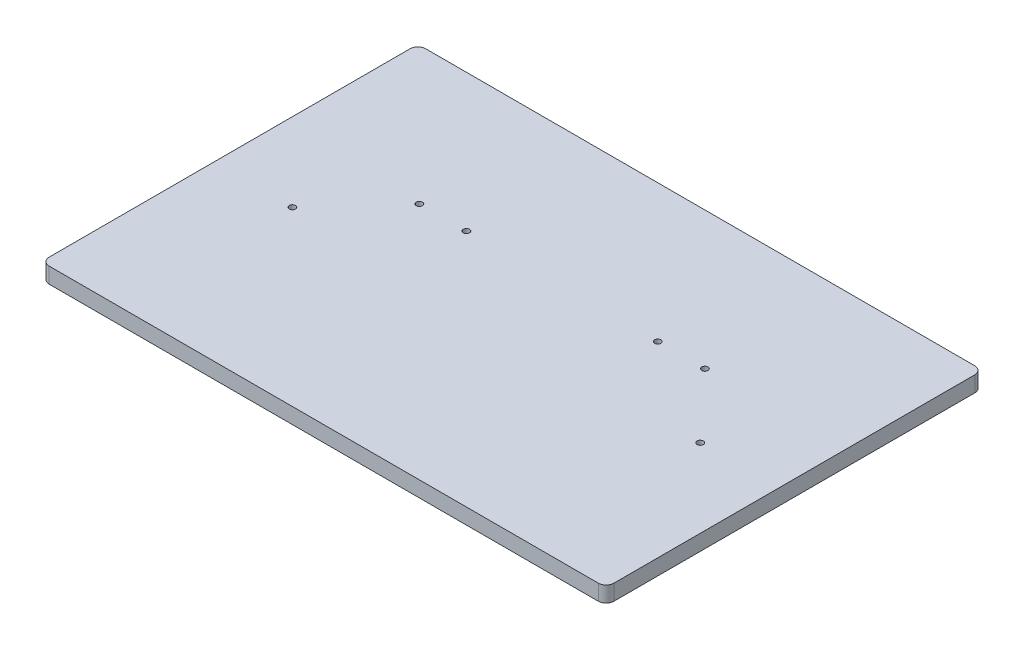
ISO-10303-21;
HEADER;
FILE_DESCRIPTION(('STEP AP214'),'2;1');
FILE_NAME('part.step','',(''),(''),'','','');
FILE_SCHEMA(('AUTOMOTIVE_DESIGN { 1 0 10303 214 1 1 1 1 }'));
ENDSEC;
DATA;
#1=APPLICATION_CONTEXT('core data for automotive mechanical design processes');
#2=APPLICATION_PROTOCOL_DEFINITION('international standard','automotive_design',2000,#1);
#3=PRODUCT_CONTEXT('',#1,'mechanical');
#4=PRODUCT('Part','Part','',(#3));
#5=PRODUCT_RELATED_PRODUCT_CATEGORY('part','',(#4));
#6=PRODUCT_DEFINITION_FORMATION('','',#4);
#7=PRODUCT_DEFINITION_CONTEXT('part definition',#1,'design');
#8=PRODUCT_DEFINITION('design','',#6,#7);
#9=PRODUCT_DEFINITION_SHAPE('','',#8);
#10=(LENGTH_UNIT() NAMED_UNIT(*) SI_UNIT(.MILLI.,.METRE.));
#11=(NAMED_UNIT(*) PLANE_ANGLE_UNIT() SI_UNIT($,.RADIAN.));
#12=(NAMED_UNIT(*) SI_UNIT($,.STERADIAN.) SOLID_ANGLE_UNIT());
#13=UNCERTAINTY_MEASURE_WITH_UNIT(LENGTH_MEASURE(1.E-05),#10,'distance_accuracy_value','');
#14=(GEOMETRIC_REPRESENTATION_CONTEXT(3) GLOBAL_UNCERTAINTY_ASSIGNED_CONTEXT((#13)) GLOBAL_UNIT_ASSIGNED_CONTEXT((#10,
#11,#12)) REPRESENTATION_CONTEXT('',''));
#15=CARTESIAN_POINT('',(0.,0.,0.));
#16=DIRECTION('',(0.,0.,1.));
#17=DIRECTION('',(1.,0.,0.));
#18=AXIS2_PLACEMENT_3D('',#15,#16,#17);
#19=CARTESIAN_POINT('',(-222.25,12.7,-146.05));
#20=DIRECTION('',(0.,1.,0.));
#21=DIRECTION('',(0.,0.,1.));
#22=AXIS2_PLACEMENT_3D('',#19,#20,#21);
#23=PLANE('',#22);
#24=CARTESIAN_POINT('',(115.07469238,12.7,-41.0459369351617));
#25=DIRECTION('',(0.,1.,0.));
#26=DIRECTION('',(0.,0.,1.));
#27=AXIS2_PLACEMENT_3D('',#24,#25,#26);
#28=CIRCLE('',#27,2.54000000000001);
#29=CARTESIAN_POINT('',(115.07469238,12.7,-38.5059369351617));
#30=VERTEX_POINT('',#29);
#31=EDGE_CURVE('E209',#30,#30,#28,.T.);
#32=ORIENTED_EDGE('',*,*,#31,.F.);
#33=EDGE_LOOP('',(#32));
#34=FACE_BOUND('',#33,.T.);
#35=CARTESIAN_POINT('',(76.97469238,12.7,-41.0459369351617));
#36=DIRECTION('',(0.,1.,0.));
#37=DIRECTION('',(0.,0.,1.));
#38=AXIS2_PLACEMENT_3D('',#35,#36,#37);
#39=CIRCLE('',#38,2.54);
#40=CARTESIAN_POINT('',(76.97469238,12.7,-38.5059369351617));
#41=VERTEX_POINT('',#40);
#42=EDGE_CURVE('E203',#41,#41,#39,.T.);
#43=ORIENTED_EDGE('',*,*,#42,.F.);
#44=EDGE_LOOP('',(#43));
#45=FACE_BOUND('',#44,.T.);
#46=CARTESIAN_POINT('',(-77.96530762,12.7,-41.0459369351617));
#47=DIRECTION('',(0.,1.,0.));
#48=DIRECTION('',(0.,0.,1.));
#49=AXIS2_PLACEMENT_3D('',#46,#47,#48);
#50=CIRCLE('',#49,2.53999999999998);
#51=CARTESIAN_POINT('',(-77.96530762,12.7,-38.5059369351617));
#52=VERTEX_POINT('',#51);
#53=EDGE_CURVE('E197',#52,#52,#50,.T.);
#54=ORIENTED_EDGE('',*,*,#53,.F.);
#55=EDGE_LOOP('',(#54));
#56=FACE_BOUND('',#55,.T.);
#57=CARTESIAN_POINT('',(-116.06530762,12.7,-41.0459369351617));
#58=DIRECTION('',(0.,1.,0.));
#59=DIRECTION('',(0.,0.,1.));
#60=AXIS2_PLACEMENT_3D('',#57,#58,#59);
#61=CIRCLE('',#60,2.53999999999998);
#62=CARTESIAN_POINT('',(-116.06530762,12.7,-38.5059369351617));
#63=VERTEX_POINT('',#62);
#64=EDGE_CURVE('E191',#63,#63,#61,.T.);
#65=ORIENTED_EDGE('',*,*,#64,.F.);
#66=EDGE_LOOP('',(#65));
#67=FACE_BOUND('',#66,.T.);
#68=CARTESIAN_POINT('',(-165.1,12.7,12.7));
#69=DIRECTION('',(0.,1.,0.));
#70=DIRECTION('',(0.,0.,1.));
#71=AXIS2_PLACEMENT_3D('',#68,#69,#70);
#72=CIRCLE('',#71,2.53999999999998);
#73=CARTESIAN_POINT('',(-165.1,12.7,15.24));
#74=VERTEX_POINT('',#73);
#75=EDGE_CURVE('E134',#74,#74,#72,.T.);
#76=ORIENTED_EDGE('',*,*,#75,.F.);
#77=EDGE_LOOP('',(#76));
#78=FACE_BOUND('',#77,.T.);
#79=CARTESIAN_POINT('',(-222.25,12.7,-146.05));
#80=DIRECTION('',(0.,1.,0.));
#81=DIRECTION('',(0.,0.,1.));
#82=AXIS2_PLACEMENT_3D('',#79,#80,#81);
#83=CIRCLE('',#82,6.34999999999999);
#84=CARTESIAN_POINT('',(-222.25,12.7,-152.4));
#85=VERTEX_POINT('',#84);
#86=CARTESIAN_POINT('',(-228.6,12.7,-146.05));
#87=VERTEX_POINT('',#86);
#88=EDGE_CURVE('E145',#85,#87,#83,.T.);
#89=ORIENTED_EDGE('',*,*,#88,.T.);
#90=DIRECTION('',(0.,0.,1.));
#91=VECTOR('',#90,1.);
#92=CARTESIAN_POINT('',(-228.6,12.7,-146.05));
#93=LINE('',#92,#91);
#94=CARTESIAN_POINT('',(-228.6,12.7,146.05));
#95=VERTEX_POINT('',#94);
#96=EDGE_CURVE('E93',#87,#95,#93,.T.);
#97=ORIENTED_EDGE('',*,*,#96,.T.);
#98=CARTESIAN_POINT('',(-222.25,12.7,146.05));
#99=DIRECTION('',(0.,1.,0.));
#100=DIRECTION('',(0.,0.,-1.));
#101=AXIS2_PLACEMENT_3D('',#98,#99,#100);
#102=CIRCLE('',#101,6.34999999999999);
#103=CARTESIAN_POINT('',(-222.25,12.7,152.4));
#104=VERTEX_POINT('',#103);
#105=EDGE_CURVE('E160',#95,#104,#102,.T.);
#106=ORIENTED_EDGE('',*,*,#105,.T.);
#107=DIRECTION('',(1.,0.,0.));
#108=VECTOR('',#107,1.);
#109=CARTESIAN_POINT('',(222.25,12.7,152.4));
#110=LINE('',#109,#108);
#111=CARTESIAN_POINT('',(222.25,12.7,152.4));
#112=VERTEX_POINT('',#111);
#113=EDGE_CURVE('E173',#104,#112,#110,.T.);
#114=ORIENTED_EDGE('',*,*,#113,.T.);
#115=CARTESIAN_POINT('',(222.25,12.7,146.05));
#116=DIRECTION('',(0.,1.,0.));
#117=DIRECTION('',(0.,0.,-1.));
#118=AXIS2_PLACEMENT_3D('',#115,#116,#117);
#119=CIRCLE('',#118,6.34999999999999);
#120=CARTESIAN_POINT('',(228.6,12.7,146.05));
#121=VERTEX_POINT('',#120);
#122=EDGE_CURVE('E112',#112,#121,#119,.T.);
#123=ORIENTED_EDGE('',*,*,#122,.T.);
#124=DIRECTION('',(0.,0.,-1.));
#125=VECTOR('',#124,1.);
#126=CARTESIAN_POINT('',(228.6,12.7,-146.05));
#127=LINE('',#126,#125);
#128=CARTESIAN_POINT('',(228.6,12.7,-146.05));
#129=VERTEX_POINT('',#128);
#130=EDGE_CURVE('E106',#121,#129,#127,.T.);
#131=ORIENTED_EDGE('',*,*,#130,.T.);
#132=CARTESIAN_POINT('',(222.25,12.7,-146.05));
#133=DIRECTION('',(0.,1.,0.));
#134=DIRECTION('',(0.,0.,-1.));
#135=AXIS2_PLACEMENT_3D('',#132,#133,#134);
#136=CIRCLE('',#135,6.34999999999999);
#137=CARTESIAN_POINT('',(222.25,12.7,-152.4));
#138=VERTEX_POINT('',#137);
#139=EDGE_CURVE('E110',#129,#138,#136,.T.);
#140=ORIENTED_EDGE('',*,*,#139,.T.);
#141=DIRECTION('',(-1.,0.,0.));
#142=VECTOR('',#141,1.);
#143=CARTESIAN_POINT('',(222.25,12.7,-152.4));
#144=LINE('',#143,#142);
#145=EDGE_CURVE('E50',#138,#85,#144,.T.);
#146=ORIENTED_EDGE('',*,*,#145,.T.);
#147=EDGE_LOOP('',(#89,#97,#106,#114,#123,#131,#140,#146));
#148=FACE_BOUND('',#147,.T.);
#149=CARTESIAN_POINT('',(165.1,12.7,12.7000000000001));
#150=DIRECTION('',(0.,1.,0.));
#151=DIRECTION('',(0.,0.,-1.));
#152=AXIS2_PLACEMENT_3D('',#149,#150,#151);
#153=CIRCLE('',#152,2.53999999999998);
#154=CARTESIAN_POINT('',(165.1,12.7,10.1600000000001));
#155=VERTEX_POINT('',#154);
#156=EDGE_CURVE('E182',#155,#155,#153,.T.);
#157=ORIENTED_EDGE('',*,*,#156,.F.);
#158=EDGE_LOOP('',(#157));
#159=FACE_BOUND('',#158,.T.);
#160=ADVANCED_FACE('F33',(#34,#45,#56,#67,#78,#148,#159),#23,.T.);
#161=CARTESIAN_POINT('',(-222.25,0.,-146.05));
#162=DIRECTION('',(0.,1.,0.));
#163=DIRECTION('',(0.,0.,1.));
#164=AXIS2_PLACEMENT_3D('',#161,#162,#163);
#165=PLANE('',#164);
#166=CARTESIAN_POINT('',(115.07469238,0.,-41.0459369351617));
#167=DIRECTION('',(0.,1.,0.));
#168=DIRECTION('',(0.,0.,1.));
#169=AXIS2_PLACEMENT_3D('',#166,#167,#168);
#170=CIRCLE('',#169,2.54000000000001);
#171=CARTESIAN_POINT('',(115.07469238,0.,-38.5059369351617));
#172=VERTEX_POINT('',#171);
#173=EDGE_CURVE('E206',#172,#172,#170,.T.);
#174=ORIENTED_EDGE('',*,*,#173,.T.);
#175=EDGE_LOOP('',(#174));
#176=FACE_BOUND('',#175,.T.);
#177=CARTESIAN_POINT('',(76.97469238,0.,-41.0459369351617));
#178=DIRECTION('',(0.,1.,0.));
#179=DIRECTION('',(0.,0.,1.));
#180=AXIS2_PLACEMENT_3D('',#177,#178,#179);
#181=CIRCLE('',#180,2.54);
#182=CARTESIAN_POINT('',(76.97469238,0.,-38.5059369351617));
#183=VERTEX_POINT('',#182);
#184=EDGE_CURVE('E200',#183,#183,#181,.T.);
#185=ORIENTED_EDGE('',*,*,#184,.T.);
#186=EDGE_LOOP('',(#185));
#187=FACE_BOUND('',#186,.T.);
#188=CARTESIAN_POINT('',(-77.96530762,0.,-41.0459369351617));
#189=DIRECTION('',(0.,1.,0.));
#190=DIRECTION('',(0.,0.,1.));
#191=AXIS2_PLACEMENT_3D('',#188,#189,#190);
#192=CIRCLE('',#191,2.53999999999998);
#193=CARTESIAN_POINT('',(-77.96530762,0.,-38.5059369351617));
#194=VERTEX_POINT('',#193);
#195=EDGE_CURVE('E194',#194,#194,#192,.T.);
#196=ORIENTED_EDGE('',*,*,#195,.T.);
#197=EDGE_LOOP('',(#196));
#198=FACE_BOUND('',#197,.T.);
#199=CARTESIAN_POINT('',(-116.06530762,0.,-41.0459369351617));
#200=DIRECTION('',(0.,1.,0.));
#201=DIRECTION('',(0.,0.,1.));
#202=AXIS2_PLACEMENT_3D('',#199,#200,#201);
#203=CIRCLE('',#202,2.53999999999998);
#204=CARTESIAN_POINT('',(-116.06530762,0.,-38.5059369351617));
#205=VERTEX_POINT('',#204);
#206=EDGE_CURVE('E188',#205,#205,#203,.T.);
#207=ORIENTED_EDGE('',*,*,#206,.T.);
#208=EDGE_LOOP('',(#207));
#209=FACE_BOUND('',#208,.T.);
#210=CARTESIAN_POINT('',(-165.1,0.,12.7));
#211=DIRECTION('',(0.,1.,0.));
#212=DIRECTION('',(0.,0.,1.));
#213=AXIS2_PLACEMENT_3D('',#210,#211,#212);
#214=CIRCLE('',#213,2.53999999999998);
#215=CARTESIAN_POINT('',(-165.1,0.,15.24));
#216=VERTEX_POINT('',#215);
#217=EDGE_CURVE('E179',#216,#216,#214,.T.);
#218=ORIENTED_EDGE('',*,*,#217,.T.);
#219=EDGE_LOOP('',(#218));
#220=FACE_BOUND('',#219,.T.);
#221=CARTESIAN_POINT('',(-222.25,0.,-146.05));
#222=DIRECTION('',(0.,1.,0.));
#223=DIRECTION('',(0.,0.,1.));
#224=AXIS2_PLACEMENT_3D('',#221,#222,#223);
#225=CIRCLE('',#224,6.34999999999999);
#226=CARTESIAN_POINT('',(-222.25,0.,-152.4));
#227=VERTEX_POINT('',#226);
#228=CARTESIAN_POINT('',(-228.6,0.,-146.05));
#229=VERTEX_POINT('',#228);
#230=EDGE_CURVE('E130',#227,#229,#225,.T.);
#231=ORIENTED_EDGE('',*,*,#230,.F.);
#232=DIRECTION('',(-1.,0.,0.));
#233=VECTOR('',#232,1.);
#234=CARTESIAN_POINT('',(222.25,0.,-152.4));
#235=LINE('',#234,#233);
#236=CARTESIAN_POINT('',(222.25,0.,-152.4));
#237=VERTEX_POINT('',#236);
#238=EDGE_CURVE('E85',#237,#227,#235,.T.);
#239=ORIENTED_EDGE('',*,*,#238,.F.);
#240=CARTESIAN_POINT('',(222.25,0.,-146.05));
#241=DIRECTION('',(0.,1.,0.));
#242=DIRECTION('',(0.,0.,-1.));
#243=AXIS2_PLACEMENT_3D('',#240,#241,#242);
#244=CIRCLE('',#243,6.34999999999999);
#245=CARTESIAN_POINT('',(228.6,0.,-146.05));
#246=VERTEX_POINT('',#245);
#247=EDGE_CURVE('E79',#246,#237,#244,.T.);
#248=ORIENTED_EDGE('',*,*,#247,.F.);
#249=DIRECTION('',(0.,0.,-1.));
#250=VECTOR('',#249,1.);
#251=CARTESIAN_POINT('',(228.6,0.,-146.05));
#252=LINE('',#251,#250);
#253=CARTESIAN_POINT('',(228.6,0.,146.05));
#254=VERTEX_POINT('',#253);
#255=EDGE_CURVE('E120',#254,#246,#252,.T.);
#256=ORIENTED_EDGE('',*,*,#255,.F.);
#257=CARTESIAN_POINT('',(222.25,0.,146.05));
#258=DIRECTION('',(0.,1.,0.));
#259=DIRECTION('',(0.,0.,-1.));
#260=AXIS2_PLACEMENT_3D('',#257,#258,#259);
#261=CIRCLE('',#260,6.34999999999999);
#262=CARTESIAN_POINT('',(222.25,0.,152.4));
#263=VERTEX_POINT('',#262);
#264=EDGE_CURVE('E140',#263,#254,#261,.T.);
#265=ORIENTED_EDGE('',*,*,#264,.F.);
#266=DIRECTION('',(1.,0.,0.));
#267=VECTOR('',#266,1.);
#268=CARTESIAN_POINT('',(222.25,0.,152.4));
#269=LINE('',#268,#267);
#270=CARTESIAN_POINT('',(-222.25,0.,152.4));
#271=VERTEX_POINT('',#270);
#272=EDGE_CURVE('E138',#271,#263,#269,.T.);
#273=ORIENTED_EDGE('',*,*,#272,.F.);
#274=CARTESIAN_POINT('',(-222.25,0.,146.05));
#275=DIRECTION('',(0.,1.,0.));
#276=DIRECTION('',(0.,0.,-1.));
#277=AXIS2_PLACEMENT_3D('',#274,#275,#276);
#278=CIRCLE('',#277,6.34999999999999);
#279=CARTESIAN_POINT('',(-228.6,0.,146.05));
#280=VERTEX_POINT('',#279);
#281=EDGE_CURVE('E136',#280,#271,#278,.T.);
#282=ORIENTED_EDGE('',*,*,#281,.F.);
#283=DIRECTION('',(0.,0.,1.));
#284=VECTOR('',#283,1.);
#285=CARTESIAN_POINT('',(-228.6,0.,-146.05));
#286=LINE('',#285,#284);
#287=EDGE_CURVE('E133',#229,#280,#286,.T.);
#288=ORIENTED_EDGE('',*,*,#287,.F.);
#289=EDGE_LOOP('',(#231,#239,#248,#256,#265,#273,#282,#288));
#290=FACE_BOUND('',#289,.T.);
#291=CARTESIAN_POINT('',(165.1,0.,12.7000000000001));
#292=DIRECTION('',(0.,1.,0.));
#293=DIRECTION('',(0.,0.,-1.));
#294=AXIS2_PLACEMENT_3D('',#291,#292,#293);
#295=CIRCLE('',#294,2.53999999999998);
#296=CARTESIAN_POINT('',(165.1,0.,10.1600000000001));
#297=VERTEX_POINT('',#296);
#298=EDGE_CURVE('E185',#297,#297,#295,.T.);
#299=ORIENTED_EDGE('',*,*,#298,.T.);
#300=EDGE_LOOP('',(#299));
#301=FACE_BOUND('',#300,.T.);
#302=ADVANCED_FACE('F164',(#176,#187,#198,#209,#220,#290,#301),#165,.F.);
#303=CARTESIAN_POINT('',(-222.25,12.7,-146.05));
#304=DIRECTION('',(0.,-1.,0.));
#305=DIRECTION('',(0.,0.,-1.));
#306=AXIS2_PLACEMENT_3D('',#303,#304,#305);
#307=CYLINDRICAL_SURFACE('',#306,6.34999999999999);
#308=ORIENTED_EDGE('',*,*,#230,.T.);
#309=DIRECTION('',(0.,-1.,0.));
#310=VECTOR('',#309,1.);
#311=CARTESIAN_POINT('',(-228.6,12.7,-146.05));
#312=LINE('',#311,#310);
#313=EDGE_CURVE('E11',#87,#229,#312,.T.);
#314=ORIENTED_EDGE('',*,*,#313,.F.);
#315=ORIENTED_EDGE('',*,*,#88,.F.);
#316=DIRECTION('',(0.,-1.,0.));
#317=VECTOR('',#316,1.);
#318=CARTESIAN_POINT('',(-222.25,12.7,-152.4));
#319=LINE('',#318,#317);
#320=EDGE_CURVE('E126',#85,#227,#319,.T.);
#321=ORIENTED_EDGE('',*,*,#320,.T.);
#322=EDGE_LOOP('',(#308,#314,#315,#321));
#323=FACE_BOUND('',#322,.T.);
#324=ADVANCED_FACE('F35',(#323),#307,.T.);
#325=CARTESIAN_POINT('',(-228.6,12.7,-146.05));
#326=DIRECTION('',(1.,0.,0.));
#327=DIRECTION('',(0.,0.,-1.));
#328=AXIS2_PLACEMENT_3D('',#325,#326,#327);
#329=PLANE('',#328);
#330=ORIENTED_EDGE('',*,*,#287,.T.);
#331=DIRECTION('',(0.,-1.,0.));
#332=VECTOR('',#331,1.);
#333=CARTESIAN_POINT('',(-228.6,12.7,146.05));
#334=LINE('',#333,#332);
#335=EDGE_CURVE('E42',#95,#280,#334,.T.);
#336=ORIENTED_EDGE('',*,*,#335,.F.);
#337=ORIENTED_EDGE('',*,*,#96,.F.);
#338=ORIENTED_EDGE('',*,*,#313,.T.);
#339=EDGE_LOOP('',(#330,#336,#337,#338));
#340=FACE_BOUND('',#339,.T.);
#341=ADVANCED_FACE('F249',(#340),#329,.F.);
#342=CARTESIAN_POINT('',(-222.25,12.7,146.05));
#343=DIRECTION('',(0.,-1.,0.));
#344=DIRECTION('',(0.,0.,-1.));
#345=AXIS2_PLACEMENT_3D('',#342,#343,#344);
#346=CYLINDRICAL_SURFACE('',#345,6.34999999999999);
#347=ORIENTED_EDGE('',*,*,#281,.T.);
#348=DIRECTION('',(0.,-1.,0.));
#349=VECTOR('',#348,1.);
#350=CARTESIAN_POINT('',(-222.25,12.7,152.4));
#351=LINE('',#350,#349);
#352=EDGE_CURVE('E152',#104,#271,#351,.T.);
#353=ORIENTED_EDGE('',*,*,#352,.F.);
#354=ORIENTED_EDGE('',*,*,#105,.F.);
#355=ORIENTED_EDGE('',*,*,#335,.T.);
#356=EDGE_LOOP('',(#347,#353,#354,#355));
#357=FACE_BOUND('',#356,.T.);
#358=ADVANCED_FACE('F158',(#357),#346,.T.);
#359=CARTESIAN_POINT('',(222.25,12.7,152.4));
#360=DIRECTION('',(0.,0.,-1.));
#361=DIRECTION('',(-1.,0.,0.));
#362=AXIS2_PLACEMENT_3D('',#359,#360,#361);
#363=PLANE('',#362);
#364=ORIENTED_EDGE('',*,*,#272,.T.);
#365=DIRECTION('',(0.,-1.,0.));
#366=VECTOR('',#365,1.);
#367=CARTESIAN_POINT('',(222.25,12.7,152.4));
#368=LINE('',#367,#366);
#369=EDGE_CURVE('E149',#112,#263,#368,.T.);
#370=ORIENTED_EDGE('',*,*,#369,.F.);
#371=ORIENTED_EDGE('',*,*,#113,.F.);
#372=ORIENTED_EDGE('',*,*,#352,.T.);
#373=EDGE_LOOP('',(#364,#370,#371,#372));
#374=FACE_BOUND('',#373,.T.);
#375=ADVANCED_FACE('F169',(#374),#363,.F.);
#376=CARTESIAN_POINT('',(222.25,12.7,146.05));
#377=DIRECTION('',(0.,-1.,0.));
#378=DIRECTION('',(0.,0.,-1.));
#379=AXIS2_PLACEMENT_3D('',#376,#377,#378);
#380=CYLINDRICAL_SURFACE('',#379,6.34999999999999);
#381=ORIENTED_EDGE('',*,*,#264,.T.);
#382=DIRECTION('',(0.,-1.,0.));
#383=VECTOR('',#382,1.);
#384=CARTESIAN_POINT('',(228.6,12.7,146.05));
#385=LINE('',#384,#383);
#386=EDGE_CURVE('E121',#121,#254,#385,.T.);
#387=ORIENTED_EDGE('',*,*,#386,.F.);
#388=ORIENTED_EDGE('',*,*,#122,.F.);
#389=ORIENTED_EDGE('',*,*,#369,.T.);
#390=EDGE_LOOP('',(#381,#387,#388,#389));
#391=FACE_BOUND('',#390,.T.);
#392=ADVANCED_FACE('F172',(#391),#380,.T.);
#393=CARTESIAN_POINT('',(228.6,12.7,-146.05));
#394=DIRECTION('',(-1.,0.,0.));
#395=DIRECTION('',(0.,0.,1.));
#396=AXIS2_PLACEMENT_3D('',#393,#394,#395);
#397=PLANE('',#396);
#398=ORIENTED_EDGE('',*,*,#255,.T.);
#399=DIRECTION('',(0.,-1.,0.));
#400=VECTOR('',#399,1.);
#401=CARTESIAN_POINT('',(228.6,12.7,-146.05));
#402=LINE('',#401,#400);
#403=EDGE_CURVE('E117',#129,#246,#402,.T.);
#404=ORIENTED_EDGE('',*,*,#403,.F.);
#405=ORIENTED_EDGE('',*,*,#130,.F.);
#406=ORIENTED_EDGE('',*,*,#386,.T.);
#407=EDGE_LOOP('',(#398,#404,#405,#406));
#408=FACE_BOUND('',#407,.T.);
#409=ADVANCED_FACE('F118',(#408),#397,.F.);
#410=CARTESIAN_POINT('',(222.25,12.7,-146.05));
#411=DIRECTION('',(0.,-1.,0.));
#412=DIRECTION('',(0.,0.,-1.));
#413=AXIS2_PLACEMENT_3D('',#410,#411,#412);
#414=CYLINDRICAL_SURFACE('',#413,6.34999999999999);
#415=ORIENTED_EDGE('',*,*,#247,.T.);
#416=DIRECTION('',(0.,-1.,0.));
#417=VECTOR('',#416,1.);
#418=CARTESIAN_POINT('',(222.25,12.7,-152.4));
#419=LINE('',#418,#417);
#420=EDGE_CURVE('E122',#138,#237,#419,.T.);
#421=ORIENTED_EDGE('',*,*,#420,.F.);
#422=ORIENTED_EDGE('',*,*,#139,.F.);
#423=ORIENTED_EDGE('',*,*,#403,.T.);
#424=EDGE_LOOP('',(#415,#421,#422,#423));
#425=FACE_BOUND('',#424,.T.);
#426=ADVANCED_FACE('F124',(#425),#414,.T.);
#427=CARTESIAN_POINT('',(222.25,12.7,-152.4));
#428=DIRECTION('',(0.,0.,1.));
#429=DIRECTION('',(1.,0.,0.));
#430=AXIS2_PLACEMENT_3D('',#427,#428,#429);
#431=PLANE('',#430);
#432=ORIENTED_EDGE('',*,*,#238,.T.);
#433=ORIENTED_EDGE('',*,*,#320,.F.);
#434=ORIENTED_EDGE('',*,*,#145,.F.);
#435=ORIENTED_EDGE('',*,*,#420,.T.);
#436=EDGE_LOOP('',(#432,#433,#434,#435));
#437=FACE_BOUND('',#436,.T.);
#438=ADVANCED_FACE('F239',(#437),#431,.F.);
#439=CARTESIAN_POINT('',(-165.1,12.7,12.7));
#440=DIRECTION('',(0.,-1.,0.));
#441=DIRECTION('',(0.,0.,-1.));
#442=AXIS2_PLACEMENT_3D('',#439,#440,#441);
#443=CYLINDRICAL_SURFACE('',#442,2.53999999999998);
#444=ORIENTED_EDGE('',*,*,#75,.T.);
#445=EDGE_LOOP('',(#444));
#446=FACE_BOUND('',#445,.T.);
#447=ORIENTED_EDGE('',*,*,#217,.F.);
#448=EDGE_LOOP('',(#447));
#449=FACE_BOUND('',#448,.T.);
#450=ADVANCED_FACE('F235',(#446,#449),#443,.F.);
#451=CARTESIAN_POINT('',(165.1,12.7,12.7000000000001));
#452=DIRECTION('',(0.,-1.,0.));
#453=DIRECTION('',(0.,0.,-1.));
#454=AXIS2_PLACEMENT_3D('',#451,#452,#453);
#455=CYLINDRICAL_SURFACE('',#454,2.53999999999998);
#456=ORIENTED_EDGE('',*,*,#156,.T.);
#457=EDGE_LOOP('',(#456));
#458=FACE_BOUND('',#457,.T.);
#459=ORIENTED_EDGE('',*,*,#298,.F.);
#460=EDGE_LOOP('',(#459));
#461=FACE_BOUND('',#460,.T.);
#462=ADVANCED_FACE('F238',(#458,#461),#455,.F.);
#463=CARTESIAN_POINT('',(-116.06530762,0.,-41.0459369351617));
#464=DIRECTION('',(0.,1.,0.));
#465=DIRECTION('',(0.,0.,1.));
#466=AXIS2_PLACEMENT_3D('',#463,#464,#465);
#467=CYLINDRICAL_SURFACE('',#466,2.53999999999998);
#468=ORIENTED_EDGE('',*,*,#206,.F.);
#469=EDGE_LOOP('',(#468));
#470=FACE_BOUND('',#469,.T.);
#471=ORIENTED_EDGE('',*,*,#64,.T.);
#472=EDGE_LOOP('',(#471));
#473=FACE_BOUND('',#472,.T.);
#474=ADVANCED_FACE('F304',(#470,#473),#467,.F.);
#475=CARTESIAN_POINT('',(-77.96530762,0.,-41.0459369351617));
#476=DIRECTION('',(0.,1.,0.));
#477=DIRECTION('',(0.,0.,1.));
#478=AXIS2_PLACEMENT_3D('',#475,#476,#477);
#479=CYLINDRICAL_SURFACE('',#478,2.53999999999998);
#480=ORIENTED_EDGE('',*,*,#195,.F.);
#481=EDGE_LOOP('',(#480));
#482=FACE_BOUND('',#481,.T.);
#483=ORIENTED_EDGE('',*,*,#53,.T.);
#484=EDGE_LOOP('',(#483));
#485=FACE_BOUND('',#484,.T.);
#486=ADVANCED_FACE('F311',(#482,#485),#479,.F.);
#487=CARTESIAN_POINT('',(76.97469238,0.,-41.0459369351617));
#488=DIRECTION('',(0.,1.,0.));
#489=DIRECTION('',(0.,0.,1.));
#490=AXIS2_PLACEMENT_3D('',#487,#488,#489);
#491=CYLINDRICAL_SURFACE('',#490,2.54);
#492=ORIENTED_EDGE('',*,*,#184,.F.);
#493=EDGE_LOOP('',(#492));
#494=FACE_BOUND('',#493,.T.);
#495=ORIENTED_EDGE('',*,*,#42,.T.);
#496=EDGE_LOOP('',(#495));
#497=FACE_BOUND('',#496,.T.);
#498=ADVANCED_FACE('F220',(#494,#497),#491,.F.);
#499=CARTESIAN_POINT('',(115.07469238,0.,-41.0459369351617));
#500=DIRECTION('',(0.,1.,0.));
#501=DIRECTION('',(0.,0.,1.));
#502=AXIS2_PLACEMENT_3D('',#499,#500,#501);
#503=CYLINDRICAL_SURFACE('',#502,2.54000000000001);
#504=ORIENTED_EDGE('',*,*,#173,.F.);
#505=EDGE_LOOP('',(#504));
#506=FACE_BOUND('',#505,.T.);
#507=ORIENTED_EDGE('',*,*,#31,.T.);
#508=EDGE_LOOP('',(#507));
#509=FACE_BOUND('',#508,.T.);
#510=ADVANCED_FACE('F217',(#506,#509),#503,.F.);
#511=CLOSED_SHELL('',(#160,#302,#324,#341,#358,#375,#392,#409,#426,#438,#450,#462,#474,#486,
#498,#510));
#512=MANIFOLD_SOLID_BREP('B2',#511);
#513=ADVANCED_BREP_SHAPE_REPRESENTATION('',(#18,#512),#14);
#514=SHAPE_DEFINITION_REPRESENTATION(#9,#513);
ENDSEC;
END-ISO-10303-21;
